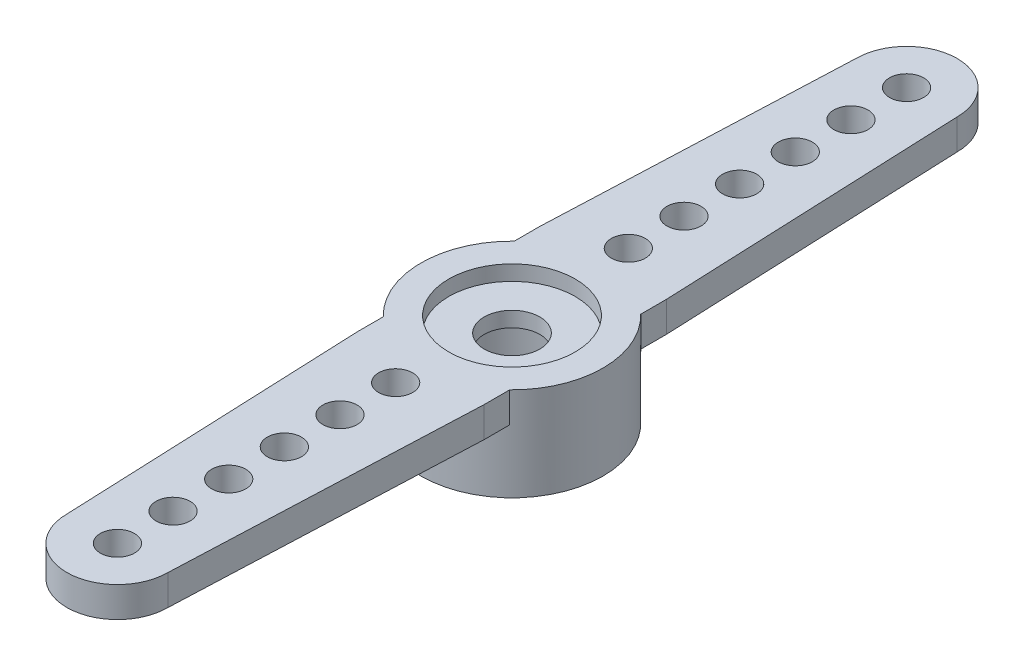
ISO-10303-21;
HEADER;
FILE_DESCRIPTION(('STEP AP214'),'2;1');
FILE_NAME('part.step','',(''),(''),'','','');
FILE_SCHEMA(('AUTOMOTIVE_DESIGN { 1 0 10303 214 1 1 1 1 }'));
ENDSEC;
DATA;
#1=APPLICATION_CONTEXT('core data for automotive mechanical design processes');
#2=APPLICATION_PROTOCOL_DEFINITION('international standard','automotive_design',2000,#1);
#3=PRODUCT_CONTEXT('',#1,'mechanical');
#4=PRODUCT('Part','Part','',(#3));
#5=PRODUCT_RELATED_PRODUCT_CATEGORY('part','',(#4));
#6=PRODUCT_DEFINITION_FORMATION('','',#4);
#7=PRODUCT_DEFINITION_CONTEXT('part definition',#1,'design');
#8=PRODUCT_DEFINITION('design','',#6,#7);
#9=PRODUCT_DEFINITION_SHAPE('','',#8);
#10=(LENGTH_UNIT() NAMED_UNIT(*) SI_UNIT(.MILLI.,.METRE.));
#11=(NAMED_UNIT(*) PLANE_ANGLE_UNIT() SI_UNIT($,.RADIAN.));
#12=(NAMED_UNIT(*) SI_UNIT($,.STERADIAN.) SOLID_ANGLE_UNIT());
#13=UNCERTAINTY_MEASURE_WITH_UNIT(LENGTH_MEASURE(1.E-05),#10,'distance_accuracy_value','');
#14=(GEOMETRIC_REPRESENTATION_CONTEXT(3) GLOBAL_UNCERTAINTY_ASSIGNED_CONTEXT((#13)) GLOBAL_UNIT_ASSIGNED_CONTEXT((#10,
#11,#12)) REPRESENTATION_CONTEXT('',''));
#15=CARTESIAN_POINT('',(0.,0.,0.));
#16=DIRECTION('',(0.,0.,1.));
#17=DIRECTION('',(1.,0.,0.));
#18=AXIS2_PLACEMENT_3D('',#15,#16,#17);
#19=CARTESIAN_POINT('',(0.,0.,-7.));
#20=DIRECTION('',(0.,1.,0.));
#21=DIRECTION('',(1.,0.,0.));
#22=AXIS2_PLACEMENT_3D('',#19,#20,#21);
#23=PLANE('',#22);
#24=CARTESIAN_POINT('',(0.,0.,-9.));
#25=DIRECTION('',(0.,-1.,0.));
#26=DIRECTION('',(-1.,0.,0.));
#27=AXIS2_PLACEMENT_3D('',#24,#25,#26);
#28=CIRCLE('',#27,0.675);
#29=CARTESIAN_POINT('',(0.675,0.,-9.));
#30=VERTEX_POINT('',#29);
#31=EDGE_CURVE('E411',#30,#30,#28,.T.);
#32=ORIENTED_EDGE('',*,*,#31,.F.);
#33=EDGE_LOOP('',(#32));
#34=FACE_BOUND('',#33,.T.);
#35=CARTESIAN_POINT('',(0.,0.,-13.4));
#36=DIRECTION('',(0.,-1.,0.));
#37=DIRECTION('',(-1.,0.,0.));
#38=AXIS2_PLACEMENT_3D('',#35,#36,#37);
#39=CIRCLE('',#38,0.675);
#40=CARTESIAN_POINT('',(0.675,0.,-13.4));
#41=VERTEX_POINT('',#40);
#42=EDGE_CURVE('E311',#41,#41,#39,.T.);
#43=ORIENTED_EDGE('',*,*,#42,.F.);
#44=EDGE_LOOP('',(#43));
#45=FACE_BOUND('',#44,.T.);
#46=CARTESIAN_POINT('',(0.,0.,-4.6));
#47=DIRECTION('',(0.,-1.,0.));
#48=DIRECTION('',(-1.,0.,0.));
#49=AXIS2_PLACEMENT_3D('',#46,#47,#48);
#50=CIRCLE('',#49,0.675);
#51=CARTESIAN_POINT('',(0.675,0.,-4.6));
#52=VERTEX_POINT('',#51);
#53=EDGE_CURVE('E306',#52,#52,#50,.T.);
#54=ORIENTED_EDGE('',*,*,#53,.F.);
#55=EDGE_LOOP('',(#54));
#56=FACE_BOUND('',#55,.T.);
#57=CARTESIAN_POINT('',(0.,0.,-11.2));
#58=DIRECTION('',(0.,-1.,0.));
#59=DIRECTION('',(-1.,0.,0.));
#60=AXIS2_PLACEMENT_3D('',#57,#58,#59);
#61=CIRCLE('',#60,0.675);
#62=CARTESIAN_POINT('',(0.675,0.,-11.2));
#63=VERTEX_POINT('',#62);
#64=EDGE_CURVE('E20',#63,#63,#61,.T.);
#65=ORIENTED_EDGE('',*,*,#64,.F.);
#66=EDGE_LOOP('',(#65));
#67=FACE_BOUND('',#66,.T.);
#68=CARTESIAN_POINT('',(0.,0.,-15.6));
#69=DIRECTION('',(0.,-1.,0.));
#70=DIRECTION('',(-1.,0.,0.));
#71=AXIS2_PLACEMENT_3D('',#68,#69,#70);
#72=CIRCLE('',#71,0.675);
#73=CARTESIAN_POINT('',(0.675,0.,-15.6));
#74=VERTEX_POINT('',#73);
#75=EDGE_CURVE('E344',#74,#74,#72,.T.);
#76=ORIENTED_EDGE('',*,*,#75,.F.);
#77=EDGE_LOOP('',(#76));
#78=FACE_BOUND('',#77,.T.);
#79=CARTESIAN_POINT('',(0.,0.,-6.8));
#80=DIRECTION('',(0.,-1.,0.));
#81=DIRECTION('',(-1.,0.,0.));
#82=AXIS2_PLACEMENT_3D('',#79,#80,#81);
#83=CIRCLE('',#82,0.675);
#84=CARTESIAN_POINT('',(0.675,0.,-6.8));
#85=VERTEX_POINT('',#84);
#86=EDGE_CURVE('E271',#85,#85,#83,.T.);
#87=ORIENTED_EDGE('',*,*,#86,.F.);
#88=EDGE_LOOP('',(#87));
#89=FACE_BOUND('',#88,.T.);
#90=CARTESIAN_POINT('',(0.,0.,0.));
#91=DIRECTION('',(0.,1.,0.));
#92=DIRECTION('',(-1.,0.,0.));
#93=AXIS2_PLACEMENT_3D('',#90,#91,#92);
#94=CIRCLE('',#93,3.6);
#95=CARTESIAN_POINT('',(2.5,0.,-2.59036676939772));
#96=VERTEX_POINT('',#95);
#97=CARTESIAN_POINT('',(-2.5,0.,-2.59036676939772));
#98=VERTEX_POINT('',#97);
#99=EDGE_CURVE('E482',#96,#98,#94,.T.);
#100=ORIENTED_EDGE('',*,*,#99,.T.);
#101=DIRECTION('',(0.,0.,1.));
#102=VECTOR('',#101,1.);
#103=CARTESIAN_POINT('',(-2.5,0.,-3.6));
#104=LINE('',#103,#102);
#105=CARTESIAN_POINT('',(-2.5,0.,-3.6));
#106=VERTEX_POINT('',#105);
#107=EDGE_CURVE('E294',#106,#98,#104,.T.);
#108=ORIENTED_EDGE('',*,*,#107,.F.);
#109=DIRECTION('',(-0.0416305447121814,0.,0.999133073092352));
#110=VECTOR('',#109,1.);
#111=CARTESIAN_POINT('',(-2.,0.,-15.6));
#112=LINE('',#111,#110);
#113=CARTESIAN_POINT('',(-2.,0.,-15.6));
#114=VERTEX_POINT('',#113);
#115=EDGE_CURVE('E266',#114,#106,#112,.T.);
#116=ORIENTED_EDGE('',*,*,#115,.F.);
#117=CARTESIAN_POINT('',(0.,0.,-15.6));
#118=DIRECTION('',(0.,1.,0.));
#119=DIRECTION('',(1.,0.,0.));
#120=AXIS2_PLACEMENT_3D('',#117,#118,#119);
#121=CIRCLE('',#120,2.);
#122=CARTESIAN_POINT('',(2.,0.,-15.6));
#123=VERTEX_POINT('',#122);
#124=EDGE_CURVE('E369',#123,#114,#121,.T.);
#125=ORIENTED_EDGE('',*,*,#124,.F.);
#126=DIRECTION('',(0.0416305447121813,0.,0.999133073092352));
#127=VECTOR('',#126,1.);
#128=CARTESIAN_POINT('',(2.,0.,-15.6));
#129=LINE('',#128,#127);
#130=CARTESIAN_POINT('',(2.5,0.,-3.6));
#131=VERTEX_POINT('',#130);
#132=EDGE_CURVE('E27',#123,#131,#129,.T.);
#133=ORIENTED_EDGE('',*,*,#132,.T.);
#134=DIRECTION('',(0.,0.,1.));
#135=VECTOR('',#134,1.);
#136=CARTESIAN_POINT('',(2.5,0.,-3.6));
#137=LINE('',#136,#135);
#138=EDGE_CURVE('E465',#131,#96,#137,.T.);
#139=ORIENTED_EDGE('',*,*,#138,.T.);
#140=EDGE_LOOP('',(#100,#108,#116,#125,#133,#139));
#141=FACE_BOUND('',#140,.T.);
#142=ADVANCED_FACE('F16',(#34,#45,#56,#67,#78,#89,#141),#23,.F.);
#143=CARTESIAN_POINT('',(0.,1.2,-7.));
#144=DIRECTION('',(0.,1.,0.));
#145=DIRECTION('',(1.,0.,0.));
#146=AXIS2_PLACEMENT_3D('',#143,#144,#145);
#147=PLANE('',#146);
#148=CARTESIAN_POINT('',(0.,1.2,-9.));
#149=DIRECTION('',(0.,-1.,0.));
#150=DIRECTION('',(-1.,0.,0.));
#151=AXIS2_PLACEMENT_3D('',#148,#149,#150);
#152=CIRCLE('',#151,0.675);
#153=CARTESIAN_POINT('',(0.675,1.2,-9.));
#154=VERTEX_POINT('',#153);
#155=EDGE_CURVE('E321',#154,#154,#152,.T.);
#156=ORIENTED_EDGE('',*,*,#155,.T.);
#157=EDGE_LOOP('',(#156));
#158=FACE_BOUND('',#157,.T.);
#159=CARTESIAN_POINT('',(0.,1.2,-13.4));
#160=DIRECTION('',(0.,-1.,0.));
#161=DIRECTION('',(-1.,0.,0.));
#162=AXIS2_PLACEMENT_3D('',#159,#160,#161);
#163=CIRCLE('',#162,0.675);
#164=CARTESIAN_POINT('',(0.675,1.2,-13.4));
#165=VERTEX_POINT('',#164);
#166=EDGE_CURVE('E451',#165,#165,#163,.T.);
#167=ORIENTED_EDGE('',*,*,#166,.T.);
#168=EDGE_LOOP('',(#167));
#169=FACE_BOUND('',#168,.T.);
#170=CARTESIAN_POINT('',(0.,1.2,-4.6));
#171=DIRECTION('',(0.,-1.,0.));
#172=DIRECTION('',(-1.,0.,0.));
#173=AXIS2_PLACEMENT_3D('',#170,#171,#172);
#174=CIRCLE('',#173,0.675);
#175=CARTESIAN_POINT('',(0.675,1.2,-4.6));
#176=VERTEX_POINT('',#175);
#177=EDGE_CURVE('E307',#176,#176,#174,.T.);
#178=ORIENTED_EDGE('',*,*,#177,.T.);
#179=EDGE_LOOP('',(#178));
#180=FACE_BOUND('',#179,.T.);
#181=CARTESIAN_POINT('',(0.,1.2,-11.2));
#182=DIRECTION('',(0.,-1.,0.));
#183=DIRECTION('',(-1.,0.,0.));
#184=AXIS2_PLACEMENT_3D('',#181,#182,#183);
#185=CIRCLE('',#184,0.675);
#186=CARTESIAN_POINT('',(0.675,1.2,-11.2));
#187=VERTEX_POINT('',#186);
#188=EDGE_CURVE('E1217',#187,#187,#185,.T.);
#189=ORIENTED_EDGE('',*,*,#188,.T.);
#190=EDGE_LOOP('',(#189));
#191=FACE_BOUND('',#190,.T.);
#192=CARTESIAN_POINT('',(0.,1.2,-15.6));
#193=DIRECTION('',(0.,-1.,0.));
#194=DIRECTION('',(-1.,0.,0.));
#195=AXIS2_PLACEMENT_3D('',#192,#193,#194);
#196=CIRCLE('',#195,0.675);
#197=CARTESIAN_POINT('',(0.675,1.2,-15.6));
#198=VERTEX_POINT('',#197);
#199=EDGE_CURVE('E937',#198,#198,#196,.T.);
#200=ORIENTED_EDGE('',*,*,#199,.T.);
#201=EDGE_LOOP('',(#200));
#202=FACE_BOUND('',#201,.T.);
#203=CARTESIAN_POINT('',(0.,1.2,-6.8));
#204=DIRECTION('',(0.,-1.,0.));
#205=DIRECTION('',(-1.,0.,0.));
#206=AXIS2_PLACEMENT_3D('',#203,#204,#205);
#207=CIRCLE('',#206,0.675);
#208=CARTESIAN_POINT('',(0.675,1.2,-6.8));
#209=VERTEX_POINT('',#208);
#210=EDGE_CURVE('E272',#209,#209,#207,.T.);
#211=ORIENTED_EDGE('',*,*,#210,.T.);
#212=EDGE_LOOP('',(#211));
#213=FACE_BOUND('',#212,.T.);
#214=CARTESIAN_POINT('',(0.,1.2,0.));
#215=DIRECTION('',(0.,-1.,0.));
#216=DIRECTION('',(1.,0.,0.));
#217=AXIS2_PLACEMENT_3D('',#214,#215,#216);
#218=CIRCLE('',#217,2.5);
#219=CARTESIAN_POINT('',(2.5,1.2,0.));
#220=VERTEX_POINT('',#219);
#221=CARTESIAN_POINT('',(-2.5,1.2,0.));
#222=VERTEX_POINT('',#221);
#223=EDGE_CURVE('E316',#220,#222,#218,.T.);
#224=ORIENTED_EDGE('',*,*,#223,.T.);
#225=CARTESIAN_POINT('',(0.,1.2,0.));
#226=DIRECTION('',(0.,-1.,0.));
#227=DIRECTION('',(1.,0.,0.));
#228=AXIS2_PLACEMENT_3D('',#225,#226,#227);
#229=CIRCLE('',#228,2.5);
#230=EDGE_CURVE('E312',#222,#220,#229,.T.);
#231=ORIENTED_EDGE('',*,*,#230,.T.);
#232=EDGE_LOOP('',(#224,#231));
#233=FACE_BOUND('',#232,.T.);
#234=CARTESIAN_POINT('',(0.,1.2,9.));
#235=DIRECTION('',(0.,-1.,0.));
#236=DIRECTION('',(1.,0.,0.));
#237=AXIS2_PLACEMENT_3D('',#234,#235,#236);
#238=CIRCLE('',#237,0.675);
#239=CARTESIAN_POINT('',(-0.675,1.2,9.));
#240=VERTEX_POINT('',#239);
#241=EDGE_CURVE('E499',#240,#240,#238,.T.);
#242=ORIENTED_EDGE('',*,*,#241,.T.);
#243=EDGE_LOOP('',(#242));
#244=FACE_BOUND('',#243,.T.);
#245=CARTESIAN_POINT('',(0.,1.2,13.4));
#246=DIRECTION('',(0.,-1.,0.));
#247=DIRECTION('',(1.,0.,0.));
#248=AXIS2_PLACEMENT_3D('',#245,#246,#247);
#249=CIRCLE('',#248,0.675);
#250=CARTESIAN_POINT('',(-0.675,1.2,13.4));
#251=VERTEX_POINT('',#250);
#252=EDGE_CURVE('E277',#251,#251,#249,.T.);
#253=ORIENTED_EDGE('',*,*,#252,.T.);
#254=EDGE_LOOP('',(#253));
#255=FACE_BOUND('',#254,.T.);
#256=CARTESIAN_POINT('',(0.,1.2,4.6));
#257=DIRECTION('',(0.,-1.,0.));
#258=DIRECTION('',(1.,0.,0.));
#259=AXIS2_PLACEMENT_3D('',#256,#257,#258);
#260=CIRCLE('',#259,0.675);
#261=CARTESIAN_POINT('',(-0.675,1.2,4.6));
#262=VERTEX_POINT('',#261);
#263=EDGE_CURVE('E420',#262,#262,#260,.T.);
#264=ORIENTED_EDGE('',*,*,#263,.T.);
#265=EDGE_LOOP('',(#264));
#266=FACE_BOUND('',#265,.T.);
#267=CARTESIAN_POINT('',(0.,1.2,11.2));
#268=DIRECTION('',(0.,-1.,0.));
#269=DIRECTION('',(1.,0.,0.));
#270=AXIS2_PLACEMENT_3D('',#267,#268,#269);
#271=CIRCLE('',#270,0.675);
#272=CARTESIAN_POINT('',(-0.675,1.2,11.2));
#273=VERTEX_POINT('',#272);
#274=EDGE_CURVE('E396',#273,#273,#271,.T.);
#275=ORIENTED_EDGE('',*,*,#274,.T.);
#276=EDGE_LOOP('',(#275));
#277=FACE_BOUND('',#276,.T.);
#278=CARTESIAN_POINT('',(0.,1.2,15.6));
#279=DIRECTION('',(0.,-1.,0.));
#280=DIRECTION('',(1.,0.,0.));
#281=AXIS2_PLACEMENT_3D('',#278,#279,#280);
#282=CIRCLE('',#281,0.675);
#283=CARTESIAN_POINT('',(-0.675,1.2,15.6));
#284=VERTEX_POINT('',#283);
#285=EDGE_CURVE('E383',#284,#284,#282,.T.);
#286=ORIENTED_EDGE('',*,*,#285,.T.);
#287=EDGE_LOOP('',(#286));
#288=FACE_BOUND('',#287,.T.);
#289=CARTESIAN_POINT('',(0.,1.2,6.8));
#290=DIRECTION('',(0.,-1.,0.));
#291=DIRECTION('',(1.,0.,0.));
#292=AXIS2_PLACEMENT_3D('',#289,#290,#291);
#293=CIRCLE('',#292,0.675);
#294=CARTESIAN_POINT('',(-0.675,1.2,6.8));
#295=VERTEX_POINT('',#294);
#296=EDGE_CURVE('E301',#295,#295,#293,.T.);
#297=ORIENTED_EDGE('',*,*,#296,.T.);
#298=EDGE_LOOP('',(#297));
#299=FACE_BOUND('',#298,.T.);
#300=DIRECTION('',(0.,0.,-1.));
#301=VECTOR('',#300,1.);
#302=CARTESIAN_POINT('',(2.5,1.2,-3.6));
#303=LINE('',#302,#301);
#304=CARTESIAN_POINT('',(2.5,1.2,-2.59036676939772));
#305=VERTEX_POINT('',#304);
#306=CARTESIAN_POINT('',(2.5,1.2,-3.6));
#307=VERTEX_POINT('',#306);
#308=EDGE_CURVE('E291',#305,#307,#303,.T.);
#309=ORIENTED_EDGE('',*,*,#308,.T.);
#310=DIRECTION('',(-0.0416305447121813,0.,-0.999133073092352));
#311=VECTOR('',#310,1.);
#312=CARTESIAN_POINT('',(2.,1.2,-15.6));
#313=LINE('',#312,#311);
#314=CARTESIAN_POINT('',(2.,1.2,-15.6));
#315=VERTEX_POINT('',#314);
#316=EDGE_CURVE('E11',#307,#315,#313,.T.);
#317=ORIENTED_EDGE('',*,*,#316,.T.);
#318=CARTESIAN_POINT('',(0.,1.2,-15.6));
#319=DIRECTION('',(0.,1.,0.));
#320=DIRECTION('',(1.,0.,0.));
#321=AXIS2_PLACEMENT_3D('',#318,#319,#320);
#322=CIRCLE('',#321,2.);
#323=CARTESIAN_POINT('',(-2.,1.2,-15.6));
#324=VERTEX_POINT('',#323);
#325=EDGE_CURVE('E373',#315,#324,#322,.T.);
#326=ORIENTED_EDGE('',*,*,#325,.T.);
#327=DIRECTION('',(-0.0416305447121814,0.,0.999133073092352));
#328=VECTOR('',#327,1.);
#329=CARTESIAN_POINT('',(-2.,1.2,-15.6));
#330=LINE('',#329,#328);
#331=CARTESIAN_POINT('',(-2.5,1.2,-3.6));
#332=VERTEX_POINT('',#331);
#333=EDGE_CURVE('E262',#324,#332,#330,.T.);
#334=ORIENTED_EDGE('',*,*,#333,.T.);
#335=DIRECTION('',(0.,0.,1.));
#336=VECTOR('',#335,1.);
#337=CARTESIAN_POINT('',(-2.5,1.2,-3.6));
#338=LINE('',#337,#336);
#339=CARTESIAN_POINT('',(-2.5,1.2,-2.59036676939772));
#340=VERTEX_POINT('',#339);
#341=EDGE_CURVE('E358',#332,#340,#338,.T.);
#342=ORIENTED_EDGE('',*,*,#341,.T.);
#343=CARTESIAN_POINT('',(0.,1.2,0.));
#344=DIRECTION('',(0.,1.,0.));
#345=DIRECTION('',(-1.,0.,0.));
#346=AXIS2_PLACEMENT_3D('',#343,#344,#345);
#347=CIRCLE('',#346,3.6);
#348=CARTESIAN_POINT('',(-2.5,1.2,2.59036676939772));
#349=VERTEX_POINT('',#348);
#350=EDGE_CURVE('E365',#340,#349,#347,.T.);
#351=ORIENTED_EDGE('',*,*,#350,.T.);
#352=DIRECTION('',(0.,0.,1.));
#353=VECTOR('',#352,1.);
#354=CARTESIAN_POINT('',(-2.5,1.2,3.6));
#355=LINE('',#354,#353);
#356=CARTESIAN_POINT('',(-2.5,1.2,3.6));
#357=VERTEX_POINT('',#356);
#358=EDGE_CURVE('E284',#349,#357,#355,.T.);
#359=ORIENTED_EDGE('',*,*,#358,.T.);
#360=DIRECTION('',(0.0416305447121814,0.,0.999133073092352));
#361=VECTOR('',#360,1.);
#362=CARTESIAN_POINT('',(-2.,1.2,15.6));
#363=LINE('',#362,#361);
#364=CARTESIAN_POINT('',(-2.,1.2,15.6));
#365=VERTEX_POINT('',#364);
#366=EDGE_CURVE('E345',#357,#365,#363,.T.);
#367=ORIENTED_EDGE('',*,*,#366,.T.);
#368=CARTESIAN_POINT('',(0.,1.2,15.6));
#369=DIRECTION('',(0.,1.,0.));
#370=DIRECTION('',(-1.,0.,0.));
#371=AXIS2_PLACEMENT_3D('',#368,#369,#370);
#372=CIRCLE('',#371,2.);
#373=CARTESIAN_POINT('',(2.,1.2,15.6));
#374=VERTEX_POINT('',#373);
#375=EDGE_CURVE('E428',#365,#374,#372,.T.);
#376=ORIENTED_EDGE('',*,*,#375,.T.);
#377=DIRECTION('',(0.0416305447121812,0.,-0.999133073092352));
#378=VECTOR('',#377,1.);
#379=CARTESIAN_POINT('',(2.,1.2,15.6));
#380=LINE('',#379,#378);
#381=CARTESIAN_POINT('',(2.5,1.2,3.6));
#382=VERTEX_POINT('',#381);
#383=EDGE_CURVE('E290',#374,#382,#380,.T.);
#384=ORIENTED_EDGE('',*,*,#383,.T.);
#385=DIRECTION('',(0.,0.,-1.));
#386=VECTOR('',#385,1.);
#387=CARTESIAN_POINT('',(2.5,1.2,3.6));
#388=LINE('',#387,#386);
#389=CARTESIAN_POINT('',(2.5,1.2,2.59036676939772));
#390=VERTEX_POINT('',#389);
#391=EDGE_CURVE('E434',#382,#390,#388,.T.);
#392=ORIENTED_EDGE('',*,*,#391,.T.);
#393=CARTESIAN_POINT('',(0.,1.2,0.));
#394=DIRECTION('',(0.,1.,0.));
#395=DIRECTION('',(-1.,0.,0.));
#396=AXIS2_PLACEMENT_3D('',#393,#394,#395);
#397=CIRCLE('',#396,3.6);
#398=CARTESIAN_POINT('',(3.6,1.2,0.));
#399=VERTEX_POINT('',#398);
#400=EDGE_CURVE('E377',#390,#399,#397,.T.);
#401=ORIENTED_EDGE('',*,*,#400,.T.);
#402=CARTESIAN_POINT('',(0.,1.2,0.));
#403=DIRECTION('',(0.,1.,0.));
#404=DIRECTION('',(-1.,0.,0.));
#405=AXIS2_PLACEMENT_3D('',#402,#403,#404);
#406=CIRCLE('',#405,3.6);
#407=EDGE_CURVE('E327',#399,#305,#406,.T.);
#408=ORIENTED_EDGE('',*,*,#407,.T.);
#409=EDGE_LOOP('',(#309,#317,#326,#334,#342,#351,#359,#367,#376,#384,#392,#401,#408));
#410=FACE_BOUND('',#409,.T.);
#411=ADVANCED_FACE('F727',(#158,#169,#180,#191,#202,#213,#233,#244,#255,#266,#277,#288,#299,
#410),#147,.T.);
#412=CARTESIAN_POINT('',(2.5,0.,-3.6));
#413=DIRECTION('',(0.999133073092352,0.,-0.0416305447121813));
#414=DIRECTION('',(0.,-1.,0.));
#415=AXIS2_PLACEMENT_3D('',#412,#413,#414);
#416=PLANE('',#415);
#417=ORIENTED_EDGE('',*,*,#132,.F.);
#418=DIRECTION('',(0.,1.,0.));
#419=VECTOR('',#418,1.);
#420=CARTESIAN_POINT('',(2.,0.,-15.6));
#421=LINE('',#420,#419);
#422=EDGE_CURVE('E376',#123,#315,#421,.T.);
#423=ORIENTED_EDGE('',*,*,#422,.T.);
#424=ORIENTED_EDGE('',*,*,#316,.F.);
#425=DIRECTION('',(0.,1.,0.));
#426=VECTOR('',#425,1.);
#427=CARTESIAN_POINT('',(2.5,0.,-3.6));
#428=LINE('',#427,#426);
#429=EDGE_CURVE('E295',#131,#307,#428,.T.);
#430=ORIENTED_EDGE('',*,*,#429,.F.);
#431=EDGE_LOOP('',(#417,#423,#424,#430));
#432=FACE_BOUND('',#431,.T.);
#433=ADVANCED_FACE('F732',(#432),#416,.T.);
#434=CARTESIAN_POINT('',(0.,0.,-15.6));
#435=DIRECTION('',(0.,1.,0.));
#436=DIRECTION('',(1.,0.,0.));
#437=AXIS2_PLACEMENT_3D('',#434,#435,#436);
#438=CYLINDRICAL_SURFACE('',#437,2.);
#439=ORIENTED_EDGE('',*,*,#124,.T.);
#440=DIRECTION('',(0.,1.,0.));
#441=VECTOR('',#440,1.);
#442=CARTESIAN_POINT('',(-2.,0.,-15.6));
#443=LINE('',#442,#441);
#444=EDGE_CURVE('E265',#114,#324,#443,.T.);
#445=ORIENTED_EDGE('',*,*,#444,.T.);
#446=ORIENTED_EDGE('',*,*,#325,.F.);
#447=ORIENTED_EDGE('',*,*,#422,.F.);
#448=EDGE_LOOP('',(#439,#445,#446,#447));
#449=FACE_BOUND('',#448,.T.);
#450=ADVANCED_FACE('F768',(#449),#438,.T.);
#451=CARTESIAN_POINT('',(-2.,0.,-15.6));
#452=DIRECTION('',(-0.999133073092352,0.,-0.0416305447121814));
#453=DIRECTION('',(-0.0416305447121814,0.,0.999133073092352));
#454=AXIS2_PLACEMENT_3D('',#451,#452,#453);
#455=PLANE('',#454);
#456=ORIENTED_EDGE('',*,*,#115,.T.);
#457=DIRECTION('',(0.,1.,0.));
#458=VECTOR('',#457,1.);
#459=CARTESIAN_POINT('',(-2.5,0.,-3.6));
#460=LINE('',#459,#458);
#461=EDGE_CURVE('E354',#106,#332,#460,.T.);
#462=ORIENTED_EDGE('',*,*,#461,.T.);
#463=ORIENTED_EDGE('',*,*,#333,.F.);
#464=ORIENTED_EDGE('',*,*,#444,.F.);
#465=EDGE_LOOP('',(#456,#462,#463,#464));
#466=FACE_BOUND('',#465,.T.);
#467=ADVANCED_FACE('F773',(#466),#455,.T.);
#468=CARTESIAN_POINT('',(-2.5,0.,-3.6));
#469=DIRECTION('',(-1.,0.,0.));
#470=DIRECTION('',(0.,1.,0.));
#471=AXIS2_PLACEMENT_3D('',#468,#469,#470);
#472=PLANE('',#471);
#473=ORIENTED_EDGE('',*,*,#107,.T.);
#474=DIRECTION('',(0.,1.,0.));
#475=VECTOR('',#474,1.);
#476=CARTESIAN_POINT('',(-2.5,0.,-2.59036676939772));
#477=LINE('',#476,#475);
#478=EDGE_CURVE('E509',#98,#340,#477,.T.);
#479=ORIENTED_EDGE('',*,*,#478,.T.);
#480=ORIENTED_EDGE('',*,*,#341,.F.);
#481=ORIENTED_EDGE('',*,*,#461,.F.);
#482=EDGE_LOOP('',(#473,#479,#480,#481));
#483=FACE_BOUND('',#482,.T.);
#484=ADVANCED_FACE('F804',(#483),#472,.T.);
#485=CARTESIAN_POINT('',(2.5,0.,-2.59036676939772));
#486=DIRECTION('',(1.,0.,0.));
#487=DIRECTION('',(0.,0.,1.));
#488=AXIS2_PLACEMENT_3D('',#485,#486,#487);
#489=PLANE('',#488);
#490=ORIENTED_EDGE('',*,*,#138,.F.);
#491=ORIENTED_EDGE('',*,*,#429,.T.);
#492=ORIENTED_EDGE('',*,*,#308,.F.);
#493=DIRECTION('',(0.,1.,0.));
#494=VECTOR('',#493,1.);
#495=CARTESIAN_POINT('',(2.5,0.,-2.59036676939772));
#496=LINE('',#495,#494);
#497=EDGE_CURVE('E332',#96,#305,#496,.T.);
#498=ORIENTED_EDGE('',*,*,#497,.F.);
#499=EDGE_LOOP('',(#490,#491,#492,#498));
#500=FACE_BOUND('',#499,.T.);
#501=ADVANCED_FACE('F825',(#500),#489,.T.);
#502=CARTESIAN_POINT('',(0.,0.,-6.8));
#503=DIRECTION('',(0.,1.,0.));
#504=DIRECTION('',(-1.,0.,0.));
#505=AXIS2_PLACEMENT_3D('',#502,#503,#504);
#506=CYLINDRICAL_SURFACE('',#505,0.675);
#507=ORIENTED_EDGE('',*,*,#210,.F.);
#508=DIRECTION('',(0.,-1.,0.));
#509=VECTOR('',#508,1.);
#510=CARTESIAN_POINT('',(0.675,0.,-6.8));
#511=LINE('',#510,#509);
#512=EDGE_CURVE('E267',#209,#85,#511,.T.);
#513=ORIENTED_EDGE('',*,*,#512,.T.);
#514=ORIENTED_EDGE('',*,*,#86,.T.);
#515=ORIENTED_EDGE('',*,*,#512,.F.);
#516=EDGE_LOOP('',(#507,#513,#514,#515));
#517=FACE_BOUND('',#516,.T.);
#518=ADVANCED_FACE('F719',(#517),#506,.F.);
#519=CARTESIAN_POINT('',(0.,0.,-15.6));
#520=DIRECTION('',(0.,1.,0.));
#521=DIRECTION('',(-1.,0.,0.));
#522=AXIS2_PLACEMENT_3D('',#519,#520,#521);
#523=CYLINDRICAL_SURFACE('',#522,0.675);
#524=ORIENTED_EDGE('',*,*,#199,.F.);
#525=DIRECTION('',(0.,-1.,0.));
#526=VECTOR('',#525,1.);
#527=CARTESIAN_POINT('',(0.675,0.,-15.6));
#528=LINE('',#527,#526);
#529=EDGE_CURVE('E491',#198,#74,#528,.T.);
#530=ORIENTED_EDGE('',*,*,#529,.T.);
#531=ORIENTED_EDGE('',*,*,#75,.T.);
#532=ORIENTED_EDGE('',*,*,#529,.F.);
#533=EDGE_LOOP('',(#524,#530,#531,#532));
#534=FACE_BOUND('',#533,.T.);
#535=ADVANCED_FACE('F714',(#534),#523,.F.);
#536=CARTESIAN_POINT('',(0.,0.,-11.2));
#537=DIRECTION('',(0.,1.,0.));
#538=DIRECTION('',(-1.,0.,0.));
#539=AXIS2_PLACEMENT_3D('',#536,#537,#538);
#540=CYLINDRICAL_SURFACE('',#539,0.675);
#541=ORIENTED_EDGE('',*,*,#188,.F.);
#542=DIRECTION('',(0.,-1.,0.));
#543=VECTOR('',#542,1.);
#544=CARTESIAN_POINT('',(0.675,0.,-11.2));
#545=LINE('',#544,#543);
#546=EDGE_CURVE('E938',#187,#63,#545,.T.);
#547=ORIENTED_EDGE('',*,*,#546,.T.);
#548=ORIENTED_EDGE('',*,*,#64,.T.);
#549=ORIENTED_EDGE('',*,*,#546,.F.);
#550=EDGE_LOOP('',(#541,#547,#548,#549));
#551=FACE_BOUND('',#550,.T.);
#552=ADVANCED_FACE('F671',(#551),#540,.F.);
#553=CARTESIAN_POINT('',(0.,0.,-4.6));
#554=DIRECTION('',(0.,1.,0.));
#555=DIRECTION('',(-1.,0.,0.));
#556=AXIS2_PLACEMENT_3D('',#553,#554,#555);
#557=CYLINDRICAL_SURFACE('',#556,0.675);
#558=ORIENTED_EDGE('',*,*,#177,.F.);
#559=DIRECTION('',(0.,-1.,0.));
#560=VECTOR('',#559,1.);
#561=CARTESIAN_POINT('',(0.675,0.,-4.6));
#562=LINE('',#561,#560);
#563=EDGE_CURVE('E302',#176,#52,#562,.T.);
#564=ORIENTED_EDGE('',*,*,#563,.T.);
#565=ORIENTED_EDGE('',*,*,#53,.T.);
#566=ORIENTED_EDGE('',*,*,#563,.F.);
#567=EDGE_LOOP('',(#558,#564,#565,#566));
#568=FACE_BOUND('',#567,.T.);
#569=ADVANCED_FACE('F625',(#568),#557,.F.);
#570=CARTESIAN_POINT('',(0.,0.,-13.4));
#571=DIRECTION('',(0.,1.,0.));
#572=DIRECTION('',(-1.,0.,0.));
#573=AXIS2_PLACEMENT_3D('',#570,#571,#572);
#574=CYLINDRICAL_SURFACE('',#573,0.675);
#575=ORIENTED_EDGE('',*,*,#166,.F.);
#576=DIRECTION('',(0.,-1.,0.));
#577=VECTOR('',#576,1.);
#578=CARTESIAN_POINT('',(0.675,0.,-13.4));
#579=LINE('',#578,#577);
#580=EDGE_CURVE('E455',#165,#41,#579,.T.);
#581=ORIENTED_EDGE('',*,*,#580,.T.);
#582=ORIENTED_EDGE('',*,*,#42,.T.);
#583=ORIENTED_EDGE('',*,*,#580,.F.);
#584=EDGE_LOOP('',(#575,#581,#582,#583));
#585=FACE_BOUND('',#584,.T.);
#586=ADVANCED_FACE('F620',(#585),#574,.F.);
#587=CARTESIAN_POINT('',(0.,0.,0.));
#588=DIRECTION('',(0.,1.,0.));
#589=DIRECTION('',(-1.,0.,0.));
#590=AXIS2_PLACEMENT_3D('',#587,#588,#589);
#591=CYLINDRICAL_SURFACE('',#590,2.5);
#592=CARTESIAN_POINT('',(0.,0.,0.));
#593=DIRECTION('',(0.,1.,0.));
#594=DIRECTION('',(-1.,0.,0.));
#595=AXIS2_PLACEMENT_3D('',#592,#593,#594);
#596=CIRCLE('',#595,2.5);
#597=CARTESIAN_POINT('',(2.5,0.,0.));
#598=VERTEX_POINT('',#597);
#599=CARTESIAN_POINT('',(-2.5,0.,0.));
#600=VERTEX_POINT('',#599);
#601=EDGE_CURVE('E245',#598,#600,#596,.T.);
#602=ORIENTED_EDGE('',*,*,#601,.T.);
#603=CARTESIAN_POINT('',(0.,0.,0.));
#604=DIRECTION('',(0.,1.,0.));
#605=DIRECTION('',(-1.,0.,0.));
#606=AXIS2_PLACEMENT_3D('',#603,#604,#605);
#607=CIRCLE('',#606,2.5);
#608=EDGE_CURVE('E333',#600,#598,#607,.T.);
#609=ORIENTED_EDGE('',*,*,#608,.T.);
#610=DIRECTION('',(0.,-1.,0.));
#611=VECTOR('',#610,1.);
#612=CARTESIAN_POINT('',(2.5,0.,0.));
#613=LINE('',#612,#611);
#614=CARTESIAN_POINT('',(2.5,-2.5,0.));
#615=VERTEX_POINT('',#614);
#616=EDGE_CURVE('E414',#598,#615,#613,.T.);
#617=ORIENTED_EDGE('',*,*,#616,.T.);
#618=CARTESIAN_POINT('',(0.,-2.5,0.));
#619=DIRECTION('',(0.,1.,0.));
#620=DIRECTION('',(-1.,0.,0.));
#621=AXIS2_PLACEMENT_3D('',#618,#619,#620);
#622=CIRCLE('',#621,2.5);
#623=CARTESIAN_POINT('',(-2.5,-2.5,0.));
#624=VERTEX_POINT('',#623);
#625=EDGE_CURVE('E317',#624,#615,#622,.T.);
#626=ORIENTED_EDGE('',*,*,#625,.F.);
#627=CARTESIAN_POINT('',(0.,-2.5,0.));
#628=DIRECTION('',(0.,1.,0.));
#629=DIRECTION('',(-1.,0.,0.));
#630=AXIS2_PLACEMENT_3D('',#627,#628,#629);
#631=CIRCLE('',#630,2.5);
#632=EDGE_CURVE('E322',#615,#624,#631,.T.);
#633=ORIENTED_EDGE('',*,*,#632,.F.);
#634=ORIENTED_EDGE('',*,*,#616,.F.);
#635=EDGE_LOOP('',(#602,#609,#617,#626,#633,#634));
#636=FACE_BOUND('',#635,.T.);
#637=ADVANCED_FACE('F611',(#636),#591,.F.);
#638=CARTESIAN_POINT('',(0.,0.,-9.));
#639=DIRECTION('',(0.,1.,0.));
#640=DIRECTION('',(-1.,0.,0.));
#641=AXIS2_PLACEMENT_3D('',#638,#639,#640);
#642=CYLINDRICAL_SURFACE('',#641,0.675);
#643=ORIENTED_EDGE('',*,*,#155,.F.);
#644=DIRECTION('',(0.,-1.,0.));
#645=VECTOR('',#644,1.);
#646=CARTESIAN_POINT('',(0.675,0.,-9.));
#647=LINE('',#646,#645);
#648=EDGE_CURVE('E415',#154,#30,#647,.T.);
#649=ORIENTED_EDGE('',*,*,#648,.T.);
#650=ORIENTED_EDGE('',*,*,#31,.T.);
#651=ORIENTED_EDGE('',*,*,#648,.F.);
#652=EDGE_LOOP('',(#643,#649,#650,#651));
#653=FACE_BOUND('',#652,.T.);
#654=ADVANCED_FACE('F18',(#653),#642,.F.);
#655=CARTESIAN_POINT('',(0.,-2.5,0.));
#656=DIRECTION('',(0.,1.,0.));
#657=DIRECTION('',(1.,0.,0.));
#658=AXIS2_PLACEMENT_3D('',#655,#656,#657);
#659=PLANE('',#658);
#660=ORIENTED_EDGE('',*,*,#632,.T.);
#661=ORIENTED_EDGE('',*,*,#625,.T.);
#662=EDGE_LOOP('',(#660,#661));
#663=FACE_BOUND('',#662,.T.);
#664=CARTESIAN_POINT('',(0.,-2.5,0.));
#665=DIRECTION('',(0.,-1.,0.));
#666=DIRECTION('',(-1.,0.,0.));
#667=AXIS2_PLACEMENT_3D('',#664,#665,#666);
#668=CIRCLE('',#667,3.6);
#669=CARTESIAN_POINT('',(-3.6,-2.5,0.));
#670=VERTEX_POINT('',#669);
#671=CARTESIAN_POINT('',(3.6,-2.5,0.));
#672=VERTEX_POINT('',#671);
#673=EDGE_CURVE('E495',#670,#672,#668,.T.);
#674=ORIENTED_EDGE('',*,*,#673,.T.);
#675=CARTESIAN_POINT('',(0.,-2.5,0.));
#676=DIRECTION('',(0.,-1.,0.));
#677=DIRECTION('',(-1.,0.,0.));
#678=AXIS2_PLACEMENT_3D('',#675,#676,#677);
#679=CIRCLE('',#678,3.6);
#680=EDGE_CURVE('E380',#672,#670,#679,.T.);
#681=ORIENTED_EDGE('',*,*,#680,.T.);
#682=EDGE_LOOP('',(#674,#681));
#683=FACE_BOUND('',#682,.T.);
#684=ADVANCED_FACE('F610',(#663,#683),#659,.F.);
#685=CARTESIAN_POINT('',(0.,0.,0.));
#686=DIRECTION('',(0.,1.,0.));
#687=DIRECTION('',(1.,0.,0.));
#688=AXIS2_PLACEMENT_3D('',#685,#686,#687);
#689=PLANE('',#688);
#690=CARTESIAN_POINT('',(0.,0.,0.));
#691=DIRECTION('',(0.,-1.,0.));
#692=DIRECTION('',(-1.,0.,0.));
#693=AXIS2_PLACEMENT_3D('',#690,#691,#692);
#694=CIRCLE('',#693,1.1);
#695=CARTESIAN_POINT('',(1.1,0.,0.));
#696=VERTEX_POINT('',#695);
#697=CARTESIAN_POINT('',(-1.1,0.,0.));
#698=VERTEX_POINT('',#697);
#699=EDGE_CURVE('E241',#696,#698,#694,.T.);
#700=ORIENTED_EDGE('',*,*,#699,.F.);
#701=CARTESIAN_POINT('',(0.,0.,0.));
#702=DIRECTION('',(0.,-1.,0.));
#703=DIRECTION('',(-1.,0.,0.));
#704=AXIS2_PLACEMENT_3D('',#701,#702,#703);
#705=CIRCLE('',#704,1.1);
#706=EDGE_CURVE('E237',#698,#696,#705,.T.);
#707=ORIENTED_EDGE('',*,*,#706,.F.);
#708=EDGE_LOOP('',(#700,#707));
#709=FACE_BOUND('',#708,.T.);
#710=ORIENTED_EDGE('',*,*,#601,.F.);
#711=ORIENTED_EDGE('',*,*,#608,.F.);
#712=EDGE_LOOP('',(#710,#711));
#713=FACE_BOUND('',#712,.T.);
#714=ADVANCED_FACE('F239',(#709,#713),#689,.F.);
#715=CARTESIAN_POINT('',(0.,0.,0.));
#716=DIRECTION('',(0.,1.,0.));
#717=DIRECTION('',(-1.,0.,0.));
#718=AXIS2_PLACEMENT_3D('',#715,#716,#717);
#719=CYLINDRICAL_SURFACE('',#718,1.1);
#720=CARTESIAN_POINT('',(0.,0.6,0.));
#721=DIRECTION('',(0.,1.,0.));
#722=DIRECTION('',(-1.,0.,0.));
#723=AXIS2_PLACEMENT_3D('',#720,#721,#722);
#724=CIRCLE('',#723,1.1);
#725=CARTESIAN_POINT('',(-1.1,0.6,0.));
#726=VERTEX_POINT('',#725);
#727=CARTESIAN_POINT('',(1.1,0.6,0.));
#728=VERTEX_POINT('',#727);
#729=EDGE_CURVE('E468',#726,#728,#724,.T.);
#730=ORIENTED_EDGE('',*,*,#729,.T.);
#731=DIRECTION('',(0.,-1.,0.));
#732=VECTOR('',#731,1.);
#733=CARTESIAN_POINT('',(1.1,0.,0.));
#734=LINE('',#733,#732);
#735=EDGE_CURVE('E249',#728,#696,#734,.T.);
#736=ORIENTED_EDGE('',*,*,#735,.T.);
#737=ORIENTED_EDGE('',*,*,#699,.T.);
#738=ORIENTED_EDGE('',*,*,#706,.T.);
#739=ORIENTED_EDGE('',*,*,#735,.F.);
#740=CARTESIAN_POINT('',(0.,0.6,0.));
#741=DIRECTION('',(0.,1.,0.));
#742=DIRECTION('',(-1.,0.,0.));
#743=AXIS2_PLACEMENT_3D('',#740,#741,#742);
#744=CIRCLE('',#743,1.1);
#745=EDGE_CURVE('E256',#728,#726,#744,.T.);
#746=ORIENTED_EDGE('',*,*,#745,.T.);
#747=EDGE_LOOP('',(#730,#736,#737,#738,#739,#746));
#748=FACE_BOUND('',#747,.T.);
#749=ADVANCED_FACE('F248',(#748),#719,.F.);
#750=CARTESIAN_POINT('',(0.,0.6,0.));
#751=DIRECTION('',(0.,1.,0.));
#752=DIRECTION('',(1.,0.,0.));
#753=AXIS2_PLACEMENT_3D('',#750,#751,#752);
#754=PLANE('',#753);
#755=ORIENTED_EDGE('',*,*,#729,.F.);
#756=ORIENTED_EDGE('',*,*,#745,.F.);
#757=EDGE_LOOP('',(#755,#756));
#758=FACE_BOUND('',#757,.T.);
#759=CARTESIAN_POINT('',(0.,0.6,0.));
#760=DIRECTION('',(0.,-1.,0.));
#761=DIRECTION('',(1.,0.,0.));
#762=AXIS2_PLACEMENT_3D('',#759,#760,#761);
#763=CIRCLE('',#762,2.5);
#764=CARTESIAN_POINT('',(-2.5,0.6,0.));
#765=VERTEX_POINT('',#764);
#766=CARTESIAN_POINT('',(2.5,0.6,0.));
#767=VERTEX_POINT('',#766);
#768=EDGE_CURVE('E353',#765,#767,#763,.T.);
#769=ORIENTED_EDGE('',*,*,#768,.F.);
#770=CARTESIAN_POINT('',(0.,0.6,0.));
#771=DIRECTION('',(0.,-1.,0.));
#772=DIRECTION('',(1.,0.,0.));
#773=AXIS2_PLACEMENT_3D('',#770,#771,#772);
#774=CIRCLE('',#773,2.5);
#775=EDGE_CURVE('E502',#767,#765,#774,.T.);
#776=ORIENTED_EDGE('',*,*,#775,.F.);
#777=EDGE_LOOP('',(#769,#776));
#778=FACE_BOUND('',#777,.T.);
#779=ADVANCED_FACE('F646',(#758,#778),#754,.T.);
#780=CARTESIAN_POINT('',(0.,1.2,0.));
#781=DIRECTION('',(0.,-1.,0.));
#782=DIRECTION('',(1.,0.,0.));
#783=AXIS2_PLACEMENT_3D('',#780,#781,#782);
#784=CYLINDRICAL_SURFACE('',#783,2.5);
#785=ORIENTED_EDGE('',*,*,#223,.F.);
#786=ORIENTED_EDGE('',*,*,#230,.F.);
#787=DIRECTION('',(0.,-1.,0.));
#788=VECTOR('',#787,1.);
#789=CARTESIAN_POINT('',(-2.5,1.2,0.));
#790=LINE('',#789,#788);
#791=EDGE_CURVE('E315',#222,#765,#790,.T.);
#792=ORIENTED_EDGE('',*,*,#791,.T.);
#793=ORIENTED_EDGE('',*,*,#768,.T.);
#794=ORIENTED_EDGE('',*,*,#775,.T.);
#795=ORIENTED_EDGE('',*,*,#791,.F.);
#796=EDGE_LOOP('',(#785,#786,#792,#793,#794,#795));
#797=FACE_BOUND('',#796,.T.);
#798=ADVANCED_FACE('F702',(#797),#784,.F.);
#799=CARTESIAN_POINT('',(0.,0.,0.));
#800=DIRECTION('',(0.,1.,0.));
#801=DIRECTION('',(-1.,0.,0.));
#802=AXIS2_PLACEMENT_3D('',#799,#800,#801);
#803=CYLINDRICAL_SURFACE('',#802,3.6);
#804=DIRECTION('',(0.,-1.,0.));
#805=VECTOR('',#804,1.);
#806=CARTESIAN_POINT('',(2.5,0.,2.59036676939772));
#807=LINE('',#806,#805);
#808=CARTESIAN_POINT('',(2.5,0.,2.59036676939772));
#809=VERTEX_POINT('',#808);
#810=EDGE_CURVE('E362',#390,#809,#807,.T.);
#811=ORIENTED_EDGE('',*,*,#810,.T.);
#812=CARTESIAN_POINT('',(0.,0.,0.));
#813=DIRECTION('',(0.,-1.,0.));
#814=DIRECTION('',(-1.,0.,0.));
#815=AXIS2_PLACEMENT_3D('',#812,#813,#814);
#816=CIRCLE('',#815,3.6);
#817=CARTESIAN_POINT('',(-2.5,0.,2.59036676939772));
#818=VERTEX_POINT('',#817);
#819=EDGE_CURVE('E348',#809,#818,#816,.T.);
#820=ORIENTED_EDGE('',*,*,#819,.T.);
#821=DIRECTION('',(0.,1.,0.));
#822=VECTOR('',#821,1.);
#823=CARTESIAN_POINT('',(-2.5,0.,2.59036676939772));
#824=LINE('',#823,#822);
#825=EDGE_CURVE('E279',#818,#349,#824,.T.);
#826=ORIENTED_EDGE('',*,*,#825,.T.);
#827=ORIENTED_EDGE('',*,*,#350,.F.);
#828=ORIENTED_EDGE('',*,*,#478,.F.);
#829=ORIENTED_EDGE('',*,*,#99,.F.);
#830=ORIENTED_EDGE('',*,*,#497,.T.);
#831=ORIENTED_EDGE('',*,*,#407,.F.);
#832=DIRECTION('',(0.,-1.,0.));
#833=VECTOR('',#832,1.);
#834=CARTESIAN_POINT('',(3.6,0.,0.));
#835=LINE('',#834,#833);
#836=EDGE_CURVE('E331',#399,#672,#835,.T.);
#837=ORIENTED_EDGE('',*,*,#836,.T.);
#838=ORIENTED_EDGE('',*,*,#673,.F.);
#839=ORIENTED_EDGE('',*,*,#680,.F.);
#840=ORIENTED_EDGE('',*,*,#836,.F.);
#841=ORIENTED_EDGE('',*,*,#400,.F.);
#842=EDGE_LOOP('',(#811,#820,#826,#827,#828,#829,#830,#831,#837,#838,#839,#840,#841));
#843=FACE_BOUND('',#842,.T.);
#844=ADVANCED_FACE('F523',(#843),#803,.T.);
#845=CARTESIAN_POINT('',(0.,0.,7.));
#846=DIRECTION('',(0.,1.,0.));
#847=DIRECTION('',(1.,0.,0.));
#848=AXIS2_PLACEMENT_3D('',#845,#846,#847);
#849=PLANE('',#848);
#850=CARTESIAN_POINT('',(0.,0.,9.));
#851=DIRECTION('',(0.,-1.,0.));
#852=DIRECTION('',(1.,0.,0.));
#853=AXIS2_PLACEMENT_3D('',#850,#851,#852);
#854=CIRCLE('',#853,0.675);
#855=CARTESIAN_POINT('',(-0.675,0.,9.));
#856=VERTEX_POINT('',#855);
#857=EDGE_CURVE('E273',#856,#856,#854,.T.);
#858=ORIENTED_EDGE('',*,*,#857,.F.);
#859=EDGE_LOOP('',(#858));
#860=FACE_BOUND('',#859,.T.);
#861=CARTESIAN_POINT('',(0.,0.,13.4));
#862=DIRECTION('',(0.,-1.,0.));
#863=DIRECTION('',(1.,0.,0.));
#864=AXIS2_PLACEMENT_3D('',#861,#862,#863);
#865=CIRCLE('',#864,0.675);
#866=CARTESIAN_POINT('',(-0.675,0.,13.4));
#867=VERTEX_POINT('',#866);
#868=EDGE_CURVE('E459',#867,#867,#865,.T.);
#869=ORIENTED_EDGE('',*,*,#868,.F.);
#870=EDGE_LOOP('',(#869));
#871=FACE_BOUND('',#870,.T.);
#872=CARTESIAN_POINT('',(0.,0.,4.6));
#873=DIRECTION('',(0.,-1.,0.));
#874=DIRECTION('',(1.,0.,0.));
#875=AXIS2_PLACEMENT_3D('',#872,#873,#874);
#876=CIRCLE('',#875,0.675);
#877=CARTESIAN_POINT('',(-0.675,0.,4.6));
#878=VERTEX_POINT('',#877);
#879=EDGE_CURVE('E403',#878,#878,#876,.T.);
#880=ORIENTED_EDGE('',*,*,#879,.F.);
#881=EDGE_LOOP('',(#880));
#882=FACE_BOUND('',#881,.T.);
#883=CARTESIAN_POINT('',(0.,0.,11.2));
#884=DIRECTION('',(0.,-1.,0.));
#885=DIRECTION('',(1.,0.,0.));
#886=AXIS2_PLACEMENT_3D('',#883,#884,#885);
#887=CIRCLE('',#886,0.675);
#888=CARTESIAN_POINT('',(-0.675,0.,11.2));
#889=VERTEX_POINT('',#888);
#890=EDGE_CURVE('E381',#889,#889,#887,.T.);
#891=ORIENTED_EDGE('',*,*,#890,.F.);
#892=EDGE_LOOP('',(#891));
#893=FACE_BOUND('',#892,.T.);
#894=CARTESIAN_POINT('',(0.,0.,15.6));
#895=DIRECTION('',(0.,-1.,0.));
#896=DIRECTION('',(1.,0.,0.));
#897=AXIS2_PLACEMENT_3D('',#894,#895,#896);
#898=CIRCLE('',#897,0.675);
#899=CARTESIAN_POINT('',(-0.675,0.,15.6));
#900=VERTEX_POINT('',#899);
#901=EDGE_CURVE('E424',#900,#900,#898,.T.);
#902=ORIENTED_EDGE('',*,*,#901,.F.);
#903=EDGE_LOOP('',(#902));
#904=FACE_BOUND('',#903,.T.);
#905=CARTESIAN_POINT('',(0.,0.,6.8));
#906=DIRECTION('',(0.,-1.,0.));
#907=DIRECTION('',(1.,0.,0.));
#908=AXIS2_PLACEMENT_3D('',#905,#906,#907);
#909=CIRCLE('',#908,0.675);
#910=CARTESIAN_POINT('',(-0.675,0.,6.8));
#911=VERTEX_POINT('',#910);
#912=EDGE_CURVE('E300',#911,#911,#909,.T.);
#913=ORIENTED_EDGE('',*,*,#912,.F.);
#914=EDGE_LOOP('',(#913));
#915=FACE_BOUND('',#914,.T.);
#916=ORIENTED_EDGE('',*,*,#819,.F.);
#917=DIRECTION('',(0.,0.,-1.));
#918=VECTOR('',#917,1.);
#919=CARTESIAN_POINT('',(2.5,0.,3.6));
#920=LINE('',#919,#918);
#921=CARTESIAN_POINT('',(2.5,0.,3.6));
#922=VERTEX_POINT('',#921);
#923=EDGE_CURVE('E283',#922,#809,#920,.T.);
#924=ORIENTED_EDGE('',*,*,#923,.F.);
#925=DIRECTION('',(0.0416305447121812,0.,-0.999133073092352));
#926=VECTOR('',#925,1.);
#927=CARTESIAN_POINT('',(2.,0.,15.6));
#928=LINE('',#927,#926);
#929=CARTESIAN_POINT('',(2.,0.,15.6));
#930=VERTEX_POINT('',#929);
#931=EDGE_CURVE('E323',#930,#922,#928,.T.);
#932=ORIENTED_EDGE('',*,*,#931,.F.);
#933=CARTESIAN_POINT('',(0.,0.,15.6));
#934=DIRECTION('',(0.,1.,0.));
#935=DIRECTION('',(-1.,0.,0.));
#936=AXIS2_PLACEMENT_3D('',#933,#934,#935);
#937=CIRCLE('',#936,2.);
#938=CARTESIAN_POINT('',(-2.,0.,15.6));
#939=VERTEX_POINT('',#938);
#940=EDGE_CURVE('E289',#939,#930,#937,.T.);
#941=ORIENTED_EDGE('',*,*,#940,.F.);
#942=DIRECTION('',(-0.0416305447121814,0.,-0.999133073092352));
#943=VECTOR('',#942,1.);
#944=CARTESIAN_POINT('',(-2.,0.,15.6));
#945=LINE('',#944,#943);
#946=CARTESIAN_POINT('',(-2.5,0.,3.6));
#947=VERTEX_POINT('',#946);
#948=EDGE_CURVE('E349',#939,#947,#945,.T.);
#949=ORIENTED_EDGE('',*,*,#948,.T.);
#950=DIRECTION('',(0.,0.,-1.));
#951=VECTOR('',#950,1.);
#952=CARTESIAN_POINT('',(-2.5,0.,3.6));
#953=LINE('',#952,#951);
#954=EDGE_CURVE('E532',#947,#818,#953,.T.);
#955=ORIENTED_EDGE('',*,*,#954,.T.);
#956=EDGE_LOOP('',(#916,#924,#932,#941,#949,#955));
#957=FACE_BOUND('',#956,.T.);
#958=ADVANCED_FACE('F519',(#860,#871,#882,#893,#904,#915,#957),#849,.F.);
#959=CARTESIAN_POINT('',(-2.5,0.,3.6));
#960=DIRECTION('',(-0.999133073092352,0.,0.0416305447121814));
#961=DIRECTION('',(0.,1.,0.));
#962=AXIS2_PLACEMENT_3D('',#959,#960,#961);
#963=PLANE('',#962);
#964=ORIENTED_EDGE('',*,*,#948,.F.);
#965=DIRECTION('',(0.,1.,0.));
#966=VECTOR('',#965,1.);
#967=CARTESIAN_POINT('',(-2.,0.,15.6));
#968=LINE('',#967,#966);
#969=EDGE_CURVE('E410',#939,#365,#968,.T.);
#970=ORIENTED_EDGE('',*,*,#969,.T.);
#971=ORIENTED_EDGE('',*,*,#366,.F.);
#972=DIRECTION('',(0.,1.,0.));
#973=VECTOR('',#972,1.);
#974=CARTESIAN_POINT('',(-2.5,0.,3.6));
#975=LINE('',#974,#973);
#976=EDGE_CURVE('E339',#947,#357,#975,.T.);
#977=ORIENTED_EDGE('',*,*,#976,.F.);
#978=EDGE_LOOP('',(#964,#970,#971,#977));
#979=FACE_BOUND('',#978,.T.);
#980=ADVANCED_FACE('F522',(#979),#963,.T.);
#981=CARTESIAN_POINT('',(0.,0.,15.6));
#982=DIRECTION('',(0.,1.,0.));
#983=DIRECTION('',(-1.,0.,0.));
#984=AXIS2_PLACEMENT_3D('',#981,#982,#983);
#985=CYLINDRICAL_SURFACE('',#984,2.);
#986=ORIENTED_EDGE('',*,*,#940,.T.);
#987=DIRECTION('',(0.,1.,0.));
#988=VECTOR('',#987,1.);
#989=CARTESIAN_POINT('',(2.,0.,15.6));
#990=LINE('',#989,#988);
#991=EDGE_CURVE('E285',#930,#374,#990,.T.);
#992=ORIENTED_EDGE('',*,*,#991,.T.);
#993=ORIENTED_EDGE('',*,*,#375,.F.);
#994=ORIENTED_EDGE('',*,*,#969,.F.);
#995=EDGE_LOOP('',(#986,#992,#993,#994));
#996=FACE_BOUND('',#995,.T.);
#997=ADVANCED_FACE('F694',(#996),#985,.T.);
#998=CARTESIAN_POINT('',(2.,0.,15.6));
#999=DIRECTION('',(0.999133073092352,0.,0.0416305447121812));
#1000=DIRECTION('',(0.,-1.,0.));
#1001=AXIS2_PLACEMENT_3D('',#998,#999,#1000);
#1002=PLANE('',#1001);
#1003=ORIENTED_EDGE('',*,*,#931,.T.);
#1004=DIRECTION('',(0.,1.,0.));
#1005=VECTOR('',#1004,1.);
#1006=CARTESIAN_POINT('',(2.5,0.,3.6));
#1007=LINE('',#1006,#1005);
#1008=EDGE_CURVE('E326',#922,#382,#1007,.T.);
#1009=ORIENTED_EDGE('',*,*,#1008,.T.);
#1010=ORIENTED_EDGE('',*,*,#383,.F.);
#1011=ORIENTED_EDGE('',*,*,#991,.F.);
#1012=EDGE_LOOP('',(#1003,#1009,#1010,#1011));
#1013=FACE_BOUND('',#1012,.T.);
#1014=ADVANCED_FACE('F544',(#1013),#1002,.T.);
#1015=CARTESIAN_POINT('',(2.5,0.,3.6));
#1016=DIRECTION('',(1.,0.,0.));
#1017=DIRECTION('',(0.,0.,-1.));
#1018=AXIS2_PLACEMENT_3D('',#1015,#1016,#1017);
#1019=PLANE('',#1018);
#1020=ORIENTED_EDGE('',*,*,#923,.T.);
#1021=ORIENTED_EDGE('',*,*,#810,.F.);
#1022=ORIENTED_EDGE('',*,*,#391,.F.);
#1023=ORIENTED_EDGE('',*,*,#1008,.F.);
#1024=EDGE_LOOP('',(#1020,#1021,#1022,#1023));
#1025=FACE_BOUND('',#1024,.T.);
#1026=ADVANCED_FACE('F541',(#1025),#1019,.T.);
#1027=CARTESIAN_POINT('',(-2.5,0.,2.59036676939772));
#1028=DIRECTION('',(-1.,0.,0.));
#1029=DIRECTION('',(0.,0.,1.));
#1030=AXIS2_PLACEMENT_3D('',#1027,#1028,#1029);
#1031=PLANE('',#1030);
#1032=ORIENTED_EDGE('',*,*,#954,.F.);
#1033=ORIENTED_EDGE('',*,*,#976,.T.);
#1034=ORIENTED_EDGE('',*,*,#358,.F.);
#1035=ORIENTED_EDGE('',*,*,#825,.F.);
#1036=EDGE_LOOP('',(#1032,#1033,#1034,#1035));
#1037=FACE_BOUND('',#1036,.T.);
#1038=ADVANCED_FACE('F815',(#1037),#1031,.T.);
#1039=CARTESIAN_POINT('',(0.,0.,6.8));
#1040=DIRECTION('',(0.,1.,0.));
#1041=DIRECTION('',(1.,0.,0.));
#1042=AXIS2_PLACEMENT_3D('',#1039,#1040,#1041);
#1043=CYLINDRICAL_SURFACE('',#1042,0.675);
#1044=ORIENTED_EDGE('',*,*,#296,.F.);
#1045=DIRECTION('',(0.,-1.,0.));
#1046=VECTOR('',#1045,1.);
#1047=CARTESIAN_POINT('',(-0.675,0.,6.8));
#1048=LINE('',#1047,#1046);
#1049=EDGE_CURVE('E296',#295,#911,#1048,.T.);
#1050=ORIENTED_EDGE('',*,*,#1049,.T.);
#1051=ORIENTED_EDGE('',*,*,#912,.T.);
#1052=ORIENTED_EDGE('',*,*,#1049,.F.);
#1053=EDGE_LOOP('',(#1044,#1050,#1051,#1052));
#1054=FACE_BOUND('',#1053,.T.);
#1055=ADVANCED_FACE('F785',(#1054),#1043,.F.);
#1056=CARTESIAN_POINT('',(0.,0.,15.6));
#1057=DIRECTION('',(0.,1.,0.));
#1058=DIRECTION('',(1.,0.,0.));
#1059=AXIS2_PLACEMENT_3D('',#1056,#1057,#1058);
#1060=CYLINDRICAL_SURFACE('',#1059,0.675);
#1061=ORIENTED_EDGE('',*,*,#285,.F.);
#1062=DIRECTION('',(0.,-1.,0.));
#1063=VECTOR('',#1062,1.);
#1064=CARTESIAN_POINT('',(-0.675,0.,15.6));
#1065=LINE('',#1064,#1063);
#1066=EDGE_CURVE('E394',#284,#900,#1065,.T.);
#1067=ORIENTED_EDGE('',*,*,#1066,.T.);
#1068=ORIENTED_EDGE('',*,*,#901,.T.);
#1069=ORIENTED_EDGE('',*,*,#1066,.F.);
#1070=EDGE_LOOP('',(#1061,#1067,#1068,#1069));
#1071=FACE_BOUND('',#1070,.T.);
#1072=ADVANCED_FACE('F517',(#1071),#1060,.F.);
#1073=CARTESIAN_POINT('',(0.,0.,11.2));
#1074=DIRECTION('',(0.,1.,0.));
#1075=DIRECTION('',(1.,0.,0.));
#1076=AXIS2_PLACEMENT_3D('',#1073,#1074,#1075);
#1077=CYLINDRICAL_SURFACE('',#1076,0.675);
#1078=ORIENTED_EDGE('',*,*,#274,.F.);
#1079=DIRECTION('',(0.,-1.,0.));
#1080=VECTOR('',#1079,1.);
#1081=CARTESIAN_POINT('',(-0.675,0.,11.2));
#1082=LINE('',#1081,#1080);
#1083=EDGE_CURVE('E384',#273,#889,#1082,.T.);
#1084=ORIENTED_EDGE('',*,*,#1083,.T.);
#1085=ORIENTED_EDGE('',*,*,#890,.T.);
#1086=ORIENTED_EDGE('',*,*,#1083,.F.);
#1087=EDGE_LOOP('',(#1078,#1084,#1085,#1086));
#1088=FACE_BOUND('',#1087,.T.);
#1089=ADVANCED_FACE('F659',(#1088),#1077,.F.);
#1090=CARTESIAN_POINT('',(0.,0.,4.6));
#1091=DIRECTION('',(0.,1.,0.));
#1092=DIRECTION('',(1.,0.,0.));
#1093=AXIS2_PLACEMENT_3D('',#1090,#1091,#1092);
#1094=CYLINDRICAL_SURFACE('',#1093,0.675);
#1095=ORIENTED_EDGE('',*,*,#263,.F.);
#1096=DIRECTION('',(0.,-1.,0.));
#1097=VECTOR('',#1096,1.);
#1098=CARTESIAN_POINT('',(-0.675,0.,4.6));
#1099=LINE('',#1098,#1097);
#1100=EDGE_CURVE('E416',#262,#878,#1099,.T.);
#1101=ORIENTED_EDGE('',*,*,#1100,.T.);
#1102=ORIENTED_EDGE('',*,*,#879,.T.);
#1103=ORIENTED_EDGE('',*,*,#1100,.F.);
#1104=EDGE_LOOP('',(#1095,#1101,#1102,#1103));
#1105=FACE_BOUND('',#1104,.T.);
#1106=ADVANCED_FACE('F653',(#1105),#1094,.F.);
#1107=CARTESIAN_POINT('',(0.,0.,13.4));
#1108=DIRECTION('',(0.,1.,0.));
#1109=DIRECTION('',(1.,0.,0.));
#1110=AXIS2_PLACEMENT_3D('',#1107,#1108,#1109);
#1111=CYLINDRICAL_SURFACE('',#1110,0.675);
#1112=ORIENTED_EDGE('',*,*,#252,.F.);
#1113=DIRECTION('',(0.,-1.,0.));
#1114=VECTOR('',#1113,1.);
#1115=CARTESIAN_POINT('',(-0.675,0.,13.4));
#1116=LINE('',#1115,#1114);
#1117=EDGE_CURVE('E260',#251,#867,#1116,.T.);
#1118=ORIENTED_EDGE('',*,*,#1117,.T.);
#1119=ORIENTED_EDGE('',*,*,#868,.T.);
#1120=ORIENTED_EDGE('',*,*,#1117,.F.);
#1121=EDGE_LOOP('',(#1112,#1118,#1119,#1120));
#1122=FACE_BOUND('',#1121,.T.);
#1123=ADVANCED_FACE('F658',(#1122),#1111,.F.);
#1124=CARTESIAN_POINT('',(0.,0.,9.));
#1125=DIRECTION('',(0.,1.,0.));
#1126=DIRECTION('',(1.,0.,0.));
#1127=AXIS2_PLACEMENT_3D('',#1124,#1125,#1126);
#1128=CYLINDRICAL_SURFACE('',#1127,0.675);
#1129=ORIENTED_EDGE('',*,*,#241,.F.);
#1130=DIRECTION('',(0.,-1.,0.));
#1131=VECTOR('',#1130,1.);
#1132=CARTESIAN_POINT('',(-0.675,0.,9.));
#1133=LINE('',#1132,#1131);
#1134=EDGE_CURVE('E278',#240,#856,#1133,.T.);
#1135=ORIENTED_EDGE('',*,*,#1134,.T.);
#1136=ORIENTED_EDGE('',*,*,#857,.T.);
#1137=ORIENTED_EDGE('',*,*,#1134,.F.);
#1138=EDGE_LOOP('',(#1129,#1135,#1136,#1137));
#1139=FACE_BOUND('',#1138,.T.);
#1140=ADVANCED_FACE('F679',(#1139),#1128,.F.);
#1141=CLOSED_SHELL('',(#142,#411,#433,#450,#467,#484,#501,#518,#535,#552,#569,#586,#637,#654,
#684,#714,#749,#779,#798,#844,#958,#980,#997,#1014,#1026,#1038,#1055,#1072,#1089,#1106,#1123,#1140));
#1142=MANIFOLD_SOLID_BREP('B1',#1141);
#1143=ADVANCED_BREP_SHAPE_REPRESENTATION('',(#18,#1142),#14);
#1144=SHAPE_DEFINITION_REPRESENTATION(#9,#1143);
ENDSEC;
END-ISO-10303-21;
